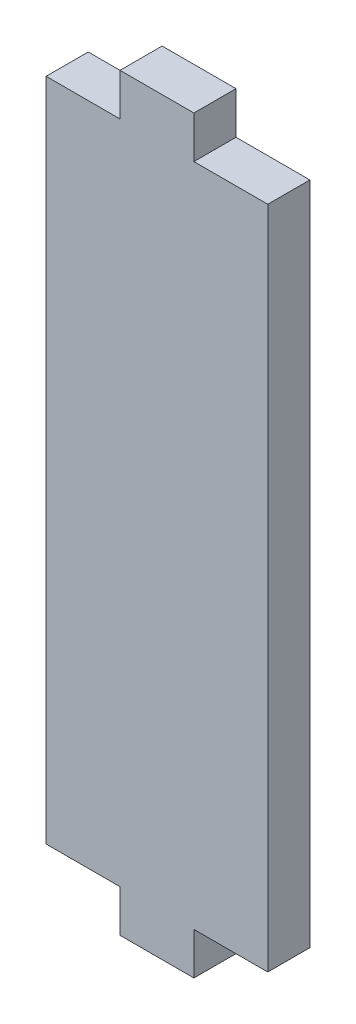
ISO-10303-21;
HEADER;
FILE_DESCRIPTION(('STEP AP214'),'2;1');
FILE_NAME('part.step','',(''),(''),'','','');
FILE_SCHEMA(('AUTOMOTIVE_DESIGN { 1 0 10303 214 1 1 1 1 }'));
ENDSEC;
DATA;
#1=APPLICATION_CONTEXT('core data for automotive mechanical design processes');
#2=APPLICATION_PROTOCOL_DEFINITION('international standard','automotive_design',2000,#1);
#3=PRODUCT_CONTEXT('',#1,'mechanical');
#4=PRODUCT('Part','Part','',(#3));
#5=PRODUCT_RELATED_PRODUCT_CATEGORY('part','',(#4));
#6=PRODUCT_DEFINITION_FORMATION('','',#4);
#7=PRODUCT_DEFINITION_CONTEXT('part definition',#1,'design');
#8=PRODUCT_DEFINITION('design','',#6,#7);
#9=PRODUCT_DEFINITION_SHAPE('','',#8);
#10=(LENGTH_UNIT() NAMED_UNIT(*) SI_UNIT(.MILLI.,.METRE.));
#11=(NAMED_UNIT(*) PLANE_ANGLE_UNIT() SI_UNIT($,.RADIAN.));
#12=(NAMED_UNIT(*) SI_UNIT($,.STERADIAN.) SOLID_ANGLE_UNIT());
#13=UNCERTAINTY_MEASURE_WITH_UNIT(LENGTH_MEASURE(1.E-05),#10,'distance_accuracy_value','');
#14=(GEOMETRIC_REPRESENTATION_CONTEXT(3) GLOBAL_UNCERTAINTY_ASSIGNED_CONTEXT((#13)) GLOBAL_UNIT_ASSIGNED_CONTEXT((#10,
#11,#12)) REPRESENTATION_CONTEXT('',''));
#15=CARTESIAN_POINT('',(0.,0.,0.));
#16=DIRECTION('',(0.,0.,1.));
#17=DIRECTION('',(1.,0.,0.));
#18=AXIS2_PLACEMENT_3D('',#15,#16,#17);
#19=CARTESIAN_POINT('',(0.,0.,4.826));
#20=DIRECTION('',(1.,0.,0.));
#21=DIRECTION('',(0.,1.,0.));
#22=AXIS2_PLACEMENT_3D('',#19,#20,#21);
#23=PLANE('',#22);
#24=DIRECTION('',(0.,-1.,0.));
#25=VECTOR('',#24,1.);
#26=CARTESIAN_POINT('',(0.,0.,4.826));
#27=LINE('',#26,#25);
#28=CARTESIAN_POINT('',(0.,81.026,4.826));
#29=VERTEX_POINT('',#28);
#30=CARTESIAN_POINT('',(0.,4.826,4.826));
#31=VERTEX_POINT('',#30);
#32=EDGE_CURVE('E202',#29,#31,#27,.T.);
#33=ORIENTED_EDGE('',*,*,#32,.F.);
#34=DIRECTION('',(0.,0.,1.));
#35=VECTOR('',#34,1.);
#36=CARTESIAN_POINT('',(0.,81.026,0.));
#37=LINE('',#36,#35);
#38=CARTESIAN_POINT('',(0.,81.026,0.));
#39=VERTEX_POINT('',#38);
#40=EDGE_CURVE('E159',#39,#29,#37,.T.);
#41=ORIENTED_EDGE('',*,*,#40,.F.);
#42=DIRECTION('',(0.,-1.,0.));
#43=VECTOR('',#42,1.);
#44=CARTESIAN_POINT('',(0.,0.,0.));
#45=LINE('',#44,#43);
#46=CARTESIAN_POINT('',(0.,4.826,0.));
#47=VERTEX_POINT('',#46);
#48=EDGE_CURVE('E198',#39,#47,#45,.T.);
#49=ORIENTED_EDGE('',*,*,#48,.T.);
#50=DIRECTION('',(0.,0.,1.));
#51=VECTOR('',#50,1.);
#52=CARTESIAN_POINT('',(0.,4.826,0.));
#53=LINE('',#52,#51);
#54=EDGE_CURVE('E195',#47,#31,#53,.T.);
#55=ORIENTED_EDGE('',*,*,#54,.T.);
#56=EDGE_LOOP('',(#33,#41,#49,#55));
#57=FACE_BOUND('',#56,.T.);
#58=ADVANCED_FACE('F33',(#57),#23,.F.);
#59=CARTESIAN_POINT('',(0.,0.,4.826));
#60=DIRECTION('',(0.,1.,0.));
#61=DIRECTION('',(0.,0.,1.));
#62=AXIS2_PLACEMENT_3D('',#59,#60,#61);
#63=PLANE('',#62);
#64=DIRECTION('',(1.,0.,0.));
#65=VECTOR('',#64,1.);
#66=CARTESIAN_POINT('',(0.,0.,0.));
#67=LINE('',#66,#65);
#68=CARTESIAN_POINT('',(8.46666666666667,0.,0.));
#69=VERTEX_POINT('',#68);
#70=CARTESIAN_POINT('',(16.9333333333333,0.,0.));
#71=VERTEX_POINT('',#70);
#72=EDGE_CURVE('E210',#69,#71,#67,.T.);
#73=ORIENTED_EDGE('',*,*,#72,.T.);
#74=DIRECTION('',(0.,0.,1.));
#75=VECTOR('',#74,1.);
#76=CARTESIAN_POINT('',(16.9333333333333,0.,0.));
#77=LINE('',#76,#75);
#78=CARTESIAN_POINT('',(16.9333333333333,0.,4.826));
#79=VERTEX_POINT('',#78);
#80=EDGE_CURVE('E172',#71,#79,#77,.T.);
#81=ORIENTED_EDGE('',*,*,#80,.T.);
#82=DIRECTION('',(1.,0.,0.));
#83=VECTOR('',#82,1.);
#84=CARTESIAN_POINT('',(0.,0.,4.826));
#85=LINE('',#84,#83);
#86=CARTESIAN_POINT('',(8.46666666666667,0.,4.826));
#87=VERTEX_POINT('',#86);
#88=EDGE_CURVE('E204',#87,#79,#85,.T.);
#89=ORIENTED_EDGE('',*,*,#88,.F.);
#90=DIRECTION('',(0.,0.,1.));
#91=VECTOR('',#90,1.);
#92=CARTESIAN_POINT('',(8.46666666666667,0.,0.));
#93=LINE('',#92,#91);
#94=EDGE_CURVE('E190',#69,#87,#93,.T.);
#95=ORIENTED_EDGE('',*,*,#94,.F.);
#96=EDGE_LOOP('',(#73,#81,#89,#95));
#97=FACE_BOUND('',#96,.T.);
#98=ADVANCED_FACE('F227',(#97),#63,.F.);
#99=CARTESIAN_POINT('',(25.4,0.,4.826));
#100=DIRECTION('',(-1.,0.,0.));
#101=DIRECTION('',(0.,-1.,0.));
#102=AXIS2_PLACEMENT_3D('',#99,#100,#101);
#103=PLANE('',#102);
#104=DIRECTION('',(0.,1.,0.));
#105=VECTOR('',#104,1.);
#106=CARTESIAN_POINT('',(25.4,0.,0.));
#107=LINE('',#106,#105);
#108=CARTESIAN_POINT('',(25.4,4.826,0.));
#109=VERTEX_POINT('',#108);
#110=CARTESIAN_POINT('',(25.4,81.026,0.));
#111=VERTEX_POINT('',#110);
#112=EDGE_CURVE('E212',#109,#111,#107,.T.);
#113=ORIENTED_EDGE('',*,*,#112,.T.);
#114=DIRECTION('',(0.,0.,1.));
#115=VECTOR('',#114,1.);
#116=CARTESIAN_POINT('',(25.4,81.026,0.));
#117=LINE('',#116,#115);
#118=CARTESIAN_POINT('',(25.4,81.026,4.826));
#119=VERTEX_POINT('',#118);
#120=EDGE_CURVE('E49',#111,#119,#117,.T.);
#121=ORIENTED_EDGE('',*,*,#120,.T.);
#122=DIRECTION('',(0.,1.,0.));
#123=VECTOR('',#122,1.);
#124=CARTESIAN_POINT('',(25.4,0.,4.826));
#125=LINE('',#124,#123);
#126=CARTESIAN_POINT('',(25.4,4.826,4.826));
#127=VERTEX_POINT('',#126);
#128=EDGE_CURVE('E41',#127,#119,#125,.T.);
#129=ORIENTED_EDGE('',*,*,#128,.F.);
#130=DIRECTION('',(0.,0.,1.));
#131=VECTOR('',#130,1.);
#132=CARTESIAN_POINT('',(25.4,4.826,0.));
#133=LINE('',#132,#131);
#134=EDGE_CURVE('E179',#109,#127,#133,.T.);
#135=ORIENTED_EDGE('',*,*,#134,.F.);
#136=EDGE_LOOP('',(#113,#121,#129,#135));
#137=FACE_BOUND('',#136,.T.);
#138=ADVANCED_FACE('F215',(#137),#103,.F.);
#139=CARTESIAN_POINT('',(0.,85.852,4.826));
#140=DIRECTION('',(0.,-1.,0.));
#141=DIRECTION('',(0.,0.,-1.));
#142=AXIS2_PLACEMENT_3D('',#139,#140,#141);
#143=PLANE('',#142);
#144=DIRECTION('',(-1.,0.,0.));
#145=VECTOR('',#144,1.);
#146=CARTESIAN_POINT('',(0.,85.852,4.826));
#147=LINE('',#146,#145);
#148=CARTESIAN_POINT('',(16.9333333333333,85.852,4.826));
#149=VERTEX_POINT('',#148);
#150=CARTESIAN_POINT('',(8.46666666666667,85.852,4.826));
#151=VERTEX_POINT('',#150);
#152=EDGE_CURVE('E11',#149,#151,#147,.T.);
#153=ORIENTED_EDGE('',*,*,#152,.F.);
#154=DIRECTION('',(0.,0.,1.));
#155=VECTOR('',#154,1.);
#156=CARTESIAN_POINT('',(16.9333333333333,85.852,0.));
#157=LINE('',#156,#155);
#158=CARTESIAN_POINT('',(16.9333333333333,85.852,0.));
#159=VERTEX_POINT('',#158);
#160=EDGE_CURVE('E144',#159,#149,#157,.T.);
#161=ORIENTED_EDGE('',*,*,#160,.F.);
#162=DIRECTION('',(-1.,0.,0.));
#163=VECTOR('',#162,1.);
#164=CARTESIAN_POINT('',(0.,85.852,0.));
#165=LINE('',#164,#163);
#166=CARTESIAN_POINT('',(8.46666666666667,85.852,0.));
#167=VERTEX_POINT('',#166);
#168=EDGE_CURVE('E36',#159,#167,#165,.T.);
#169=ORIENTED_EDGE('',*,*,#168,.T.);
#170=DIRECTION('',(0.,0.,1.));
#171=VECTOR('',#170,1.);
#172=CARTESIAN_POINT('',(8.46666666666667,85.852,0.));
#173=LINE('',#172,#171);
#174=EDGE_CURVE('E162',#167,#151,#173,.T.);
#175=ORIENTED_EDGE('',*,*,#174,.T.);
#176=EDGE_LOOP('',(#153,#161,#169,#175));
#177=FACE_BOUND('',#176,.T.);
#178=ADVANCED_FACE('F251',(#177),#143,.F.);
#179=CARTESIAN_POINT('',(0.,0.,4.826));
#180=DIRECTION('',(0.,0.,-1.));
#181=DIRECTION('',(-1.,0.,0.));
#182=AXIS2_PLACEMENT_3D('',#179,#180,#181);
#183=PLANE('',#182);
#184=DIRECTION('',(1.,0.,0.));
#185=VECTOR('',#184,1.);
#186=CARTESIAN_POINT('',(16.9333333333333,81.026,4.826));
#187=LINE('',#186,#185);
#188=CARTESIAN_POINT('',(16.9333333333333,81.026,4.826));
#189=VERTEX_POINT('',#188);
#190=EDGE_CURVE('E139',#189,#119,#187,.T.);
#191=ORIENTED_EDGE('',*,*,#190,.F.);
#192=DIRECTION('',(0.,-1.,0.));
#193=VECTOR('',#192,1.);
#194=CARTESIAN_POINT('',(16.9333333333333,85.852,4.826));
#195=LINE('',#194,#193);
#196=EDGE_CURVE('E128',#149,#189,#195,.T.);
#197=ORIENTED_EDGE('',*,*,#196,.F.);
#198=ORIENTED_EDGE('',*,*,#152,.T.);
#199=DIRECTION('',(0.,1.,0.));
#200=VECTOR('',#199,1.);
#201=CARTESIAN_POINT('',(8.46666666666667,85.852,4.826));
#202=LINE('',#201,#200);
#203=CARTESIAN_POINT('',(8.46666666666667,81.026,4.826));
#204=VERTEX_POINT('',#203);
#205=EDGE_CURVE('E152',#204,#151,#202,.T.);
#206=ORIENTED_EDGE('',*,*,#205,.F.);
#207=DIRECTION('',(1.,0.,0.));
#208=VECTOR('',#207,1.);
#209=CARTESIAN_POINT('',(0.,81.026,4.826));
#210=LINE('',#209,#208);
#211=EDGE_CURVE('E146',#29,#204,#210,.T.);
#212=ORIENTED_EDGE('',*,*,#211,.F.);
#213=ORIENTED_EDGE('',*,*,#32,.T.);
#214=DIRECTION('',(-1.,0.,0.));
#215=VECTOR('',#214,1.);
#216=CARTESIAN_POINT('',(0.,4.826,4.826));
#217=LINE('',#216,#215);
#218=CARTESIAN_POINT('',(8.46666666666667,4.826,4.826));
#219=VERTEX_POINT('',#218);
#220=EDGE_CURVE('E187',#219,#31,#217,.T.);
#221=ORIENTED_EDGE('',*,*,#220,.F.);
#222=DIRECTION('',(0.,1.,0.));
#223=VECTOR('',#222,1.);
#224=CARTESIAN_POINT('',(8.46666666666667,0.,4.826));
#225=LINE('',#224,#223);
#226=EDGE_CURVE('E178',#87,#219,#225,.T.);
#227=ORIENTED_EDGE('',*,*,#226,.F.);
#228=ORIENTED_EDGE('',*,*,#88,.T.);
#229=DIRECTION('',(0.,-1.,0.));
#230=VECTOR('',#229,1.);
#231=CARTESIAN_POINT('',(16.9333333333333,0.,4.826));
#232=LINE('',#231,#230);
#233=CARTESIAN_POINT('',(16.9333333333333,4.826,4.826));
#234=VERTEX_POINT('',#233);
#235=EDGE_CURVE('E161',#234,#79,#232,.T.);
#236=ORIENTED_EDGE('',*,*,#235,.F.);
#237=DIRECTION('',(-1.,0.,0.));
#238=VECTOR('',#237,1.);
#239=CARTESIAN_POINT('',(16.9333333333333,4.826,4.826));
#240=LINE('',#239,#238);
#241=EDGE_CURVE('E169',#127,#234,#240,.T.);
#242=ORIENTED_EDGE('',*,*,#241,.F.);
#243=ORIENTED_EDGE('',*,*,#128,.T.);
#244=EDGE_LOOP('',(#191,#197,#198,#206,#212,#213,#221,#227,#228,#236,#242,#243));
#245=FACE_BOUND('',#244,.T.);
#246=ADVANCED_FACE('F231',(#245),#183,.F.);
#247=CARTESIAN_POINT('',(0.,0.,0.));
#248=DIRECTION('',(0.,0.,-1.));
#249=DIRECTION('',(-1.,0.,0.));
#250=AXIS2_PLACEMENT_3D('',#247,#248,#249);
#251=PLANE('',#250);
#252=DIRECTION('',(0.,-1.,0.));
#253=VECTOR('',#252,1.);
#254=CARTESIAN_POINT('',(16.9333333333333,85.852,0.));
#255=LINE('',#254,#253);
#256=CARTESIAN_POINT('',(16.9333333333333,81.026,0.));
#257=VERTEX_POINT('',#256);
#258=EDGE_CURVE('E126',#159,#257,#255,.T.);
#259=ORIENTED_EDGE('',*,*,#258,.T.);
#260=DIRECTION('',(1.,0.,0.));
#261=VECTOR('',#260,1.);
#262=CARTESIAN_POINT('',(16.9333333333333,81.026,0.));
#263=LINE('',#262,#261);
#264=EDGE_CURVE('E130',#257,#111,#263,.T.);
#265=ORIENTED_EDGE('',*,*,#264,.T.);
#266=ORIENTED_EDGE('',*,*,#112,.F.);
#267=DIRECTION('',(-1.,0.,0.));
#268=VECTOR('',#267,1.);
#269=CARTESIAN_POINT('',(16.9333333333333,4.826,0.));
#270=LINE('',#269,#268);
#271=CARTESIAN_POINT('',(16.9333333333333,4.826,0.));
#272=VERTEX_POINT('',#271);
#273=EDGE_CURVE('E168',#109,#272,#270,.T.);
#274=ORIENTED_EDGE('',*,*,#273,.T.);
#275=DIRECTION('',(0.,-1.,0.));
#276=VECTOR('',#275,1.);
#277=CARTESIAN_POINT('',(16.9333333333333,0.,0.));
#278=LINE('',#277,#276);
#279=EDGE_CURVE('E165',#272,#71,#278,.T.);
#280=ORIENTED_EDGE('',*,*,#279,.T.);
#281=ORIENTED_EDGE('',*,*,#72,.F.);
#282=DIRECTION('',(0.,1.,0.));
#283=VECTOR('',#282,1.);
#284=CARTESIAN_POINT('',(8.46666666666667,0.,0.));
#285=LINE('',#284,#283);
#286=CARTESIAN_POINT('',(8.46666666666667,4.826,0.));
#287=VERTEX_POINT('',#286);
#288=EDGE_CURVE('E183',#69,#287,#285,.T.);
#289=ORIENTED_EDGE('',*,*,#288,.T.);
#290=DIRECTION('',(-1.,0.,0.));
#291=VECTOR('',#290,1.);
#292=CARTESIAN_POINT('',(0.,4.826,0.));
#293=LINE('',#292,#291);
#294=EDGE_CURVE('E186',#287,#47,#293,.T.);
#295=ORIENTED_EDGE('',*,*,#294,.T.);
#296=ORIENTED_EDGE('',*,*,#48,.F.);
#297=DIRECTION('',(1.,0.,0.));
#298=VECTOR('',#297,1.);
#299=CARTESIAN_POINT('',(0.,81.026,0.));
#300=LINE('',#299,#298);
#301=CARTESIAN_POINT('',(8.46666666666667,81.026,0.));
#302=VERTEX_POINT('',#301);
#303=EDGE_CURVE('E148',#39,#302,#300,.T.);
#304=ORIENTED_EDGE('',*,*,#303,.T.);
#305=DIRECTION('',(0.,1.,0.));
#306=VECTOR('',#305,1.);
#307=CARTESIAN_POINT('',(8.46666666666667,85.852,0.));
#308=LINE('',#307,#306);
#309=EDGE_CURVE('E151',#302,#167,#308,.T.);
#310=ORIENTED_EDGE('',*,*,#309,.T.);
#311=ORIENTED_EDGE('',*,*,#168,.F.);
#312=EDGE_LOOP('',(#259,#265,#266,#274,#280,#281,#289,#295,#296,#304,#310,#311));
#313=FACE_BOUND('',#312,.T.);
#314=ADVANCED_FACE('F137',(#313),#251,.T.);
#315=CARTESIAN_POINT('',(0.,4.826,0.));
#316=DIRECTION('',(0.,1.,0.));
#317=DIRECTION('',(0.,0.,1.));
#318=AXIS2_PLACEMENT_3D('',#315,#316,#317);
#319=PLANE('',#318);
#320=ORIENTED_EDGE('',*,*,#220,.T.);
#321=ORIENTED_EDGE('',*,*,#54,.F.);
#322=ORIENTED_EDGE('',*,*,#294,.F.);
#323=DIRECTION('',(0.,0.,1.));
#324=VECTOR('',#323,1.);
#325=CARTESIAN_POINT('',(8.46666666666667,4.826,0.));
#326=LINE('',#325,#324);
#327=EDGE_CURVE('E199',#287,#219,#326,.T.);
#328=ORIENTED_EDGE('',*,*,#327,.T.);
#329=EDGE_LOOP('',(#320,#321,#322,#328));
#330=FACE_BOUND('',#329,.T.);
#331=ADVANCED_FACE('F239',(#330),#319,.F.);
#332=CARTESIAN_POINT('',(8.46666666666667,0.,0.));
#333=DIRECTION('',(1.,0.,0.));
#334=DIRECTION('',(0.,0.,-1.));
#335=AXIS2_PLACEMENT_3D('',#332,#333,#334);
#336=PLANE('',#335);
#337=ORIENTED_EDGE('',*,*,#226,.T.);
#338=ORIENTED_EDGE('',*,*,#327,.F.);
#339=ORIENTED_EDGE('',*,*,#288,.F.);
#340=ORIENTED_EDGE('',*,*,#94,.T.);
#341=EDGE_LOOP('',(#337,#338,#339,#340));
#342=FACE_BOUND('',#341,.T.);
#343=ADVANCED_FACE('F235',(#342),#336,.F.);
#344=CARTESIAN_POINT('',(16.9333333333333,0.,0.));
#345=DIRECTION('',(-1.,0.,0.));
#346=DIRECTION('',(0.,0.,1.));
#347=AXIS2_PLACEMENT_3D('',#344,#345,#346);
#348=PLANE('',#347);
#349=ORIENTED_EDGE('',*,*,#235,.T.);
#350=ORIENTED_EDGE('',*,*,#80,.F.);
#351=ORIENTED_EDGE('',*,*,#279,.F.);
#352=DIRECTION('',(0.,0.,1.));
#353=VECTOR('',#352,1.);
#354=CARTESIAN_POINT('',(16.9333333333333,4.826,0.));
#355=LINE('',#354,#353);
#356=EDGE_CURVE('E176',#272,#234,#355,.T.);
#357=ORIENTED_EDGE('',*,*,#356,.T.);
#358=EDGE_LOOP('',(#349,#350,#351,#357));
#359=FACE_BOUND('',#358,.T.);
#360=ADVANCED_FACE('F224',(#359),#348,.F.);
#361=CARTESIAN_POINT('',(16.9333333333333,4.826,0.));
#362=DIRECTION('',(0.,1.,0.));
#363=DIRECTION('',(0.,0.,1.));
#364=AXIS2_PLACEMENT_3D('',#361,#362,#363);
#365=PLANE('',#364);
#366=ORIENTED_EDGE('',*,*,#241,.T.);
#367=ORIENTED_EDGE('',*,*,#356,.F.);
#368=ORIENTED_EDGE('',*,*,#273,.F.);
#369=ORIENTED_EDGE('',*,*,#134,.T.);
#370=EDGE_LOOP('',(#366,#367,#368,#369));
#371=FACE_BOUND('',#370,.T.);
#372=ADVANCED_FACE('F220',(#371),#365,.F.);
#373=CARTESIAN_POINT('',(0.,81.026,0.));
#374=DIRECTION('',(0.,-1.,0.));
#375=DIRECTION('',(0.,0.,-1.));
#376=AXIS2_PLACEMENT_3D('',#373,#374,#375);
#377=PLANE('',#376);
#378=ORIENTED_EDGE('',*,*,#211,.T.);
#379=DIRECTION('',(0.,0.,1.));
#380=VECTOR('',#379,1.);
#381=CARTESIAN_POINT('',(8.46666666666667,81.026,0.));
#382=LINE('',#381,#380);
#383=EDGE_CURVE('E154',#302,#204,#382,.T.);
#384=ORIENTED_EDGE('',*,*,#383,.F.);
#385=ORIENTED_EDGE('',*,*,#303,.F.);
#386=ORIENTED_EDGE('',*,*,#40,.T.);
#387=EDGE_LOOP('',(#378,#384,#385,#386));
#388=FACE_BOUND('',#387,.T.);
#389=ADVANCED_FACE('F245',(#388),#377,.F.);
#390=CARTESIAN_POINT('',(8.46666666666667,85.852,0.));
#391=DIRECTION('',(1.,0.,0.));
#392=DIRECTION('',(0.,0.,-1.));
#393=AXIS2_PLACEMENT_3D('',#390,#391,#392);
#394=PLANE('',#393);
#395=ORIENTED_EDGE('',*,*,#205,.T.);
#396=ORIENTED_EDGE('',*,*,#174,.F.);
#397=ORIENTED_EDGE('',*,*,#309,.F.);
#398=ORIENTED_EDGE('',*,*,#383,.T.);
#399=EDGE_LOOP('',(#395,#396,#397,#398));
#400=FACE_BOUND('',#399,.T.);
#401=ADVANCED_FACE('F249',(#400),#394,.F.);
#402=CARTESIAN_POINT('',(16.9333333333333,85.852,0.));
#403=DIRECTION('',(-1.,0.,0.));
#404=DIRECTION('',(0.,0.,1.));
#405=AXIS2_PLACEMENT_3D('',#402,#403,#404);
#406=PLANE('',#405);
#407=ORIENTED_EDGE('',*,*,#196,.T.);
#408=DIRECTION('',(0.,0.,1.));
#409=VECTOR('',#408,1.);
#410=CARTESIAN_POINT('',(16.9333333333333,81.026,0.));
#411=LINE('',#410,#409);
#412=EDGE_CURVE('E123',#257,#189,#411,.T.);
#413=ORIENTED_EDGE('',*,*,#412,.F.);
#414=ORIENTED_EDGE('',*,*,#258,.F.);
#415=ORIENTED_EDGE('',*,*,#160,.T.);
#416=EDGE_LOOP('',(#407,#413,#414,#415));
#417=FACE_BOUND('',#416,.T.);
#418=ADVANCED_FACE('F124',(#417),#406,.F.);
#419=CARTESIAN_POINT('',(16.9333333333333,81.026,0.));
#420=DIRECTION('',(0.,-1.,0.));
#421=DIRECTION('',(0.,0.,-1.));
#422=AXIS2_PLACEMENT_3D('',#419,#420,#421);
#423=PLANE('',#422);
#424=ORIENTED_EDGE('',*,*,#190,.T.);
#425=ORIENTED_EDGE('',*,*,#120,.F.);
#426=ORIENTED_EDGE('',*,*,#264,.F.);
#427=ORIENTED_EDGE('',*,*,#412,.T.);
#428=EDGE_LOOP('',(#424,#425,#426,#427));
#429=FACE_BOUND('',#428,.T.);
#430=ADVANCED_FACE('F132',(#429),#423,.F.);
#431=CLOSED_SHELL('',(#58,#98,#138,#178,#246,#314,#331,#343,#360,#372,#389,#401,#418,#430));
#432=MANIFOLD_SOLID_BREP('B2',#431);
#433=ADVANCED_BREP_SHAPE_REPRESENTATION('',(#18,#432),#14);
#434=SHAPE_DEFINITION_REPRESENTATION(#9,#433);
ENDSEC;
END-ISO-10303-21;
